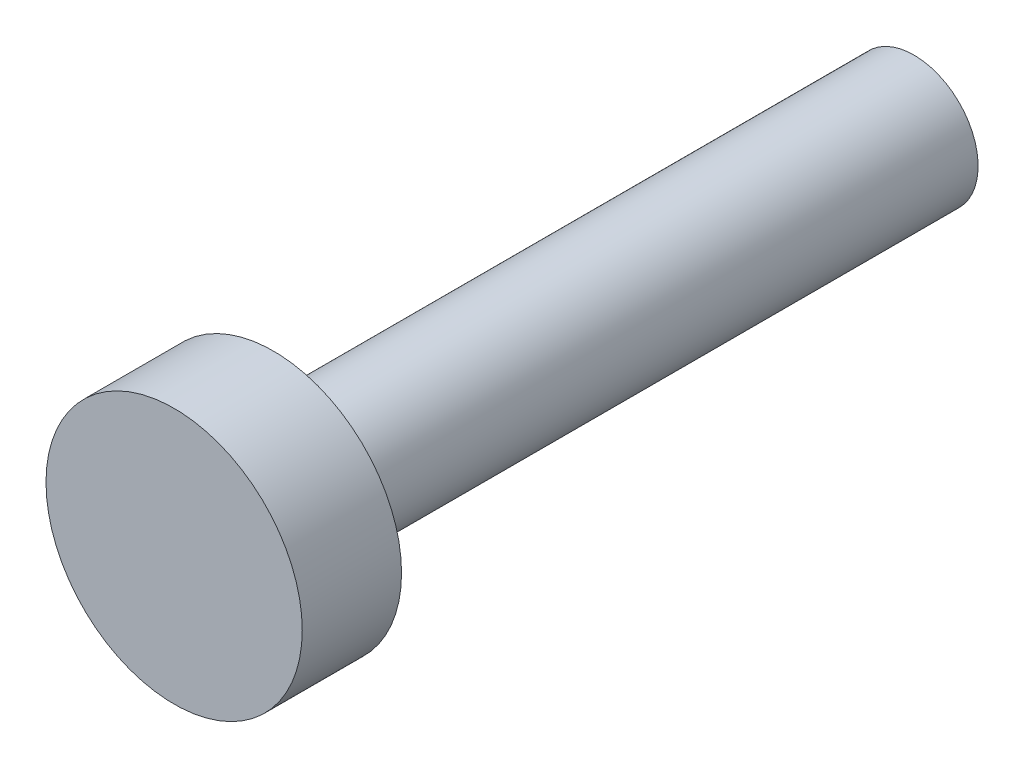
ISO-10303-21;
HEADER;
FILE_DESCRIPTION(('STEP AP214'),'2;1');
FILE_NAME('part.step','',(''),(''),'','','');
FILE_SCHEMA(('AUTOMOTIVE_DESIGN { 1 0 10303 214 1 1 1 1 }'));
ENDSEC;
DATA;
#1=APPLICATION_CONTEXT('core data for automotive mechanical design processes');
#2=APPLICATION_PROTOCOL_DEFINITION('international standard','automotive_design',2000,#1);
#3=PRODUCT_CONTEXT('',#1,'mechanical');
#4=PRODUCT('Part','Part','',(#3));
#5=PRODUCT_RELATED_PRODUCT_CATEGORY('part','',(#4));
#6=PRODUCT_DEFINITION_FORMATION('','',#4);
#7=PRODUCT_DEFINITION_CONTEXT('part definition',#1,'design');
#8=PRODUCT_DEFINITION('design','',#6,#7);
#9=PRODUCT_DEFINITION_SHAPE('','',#8);
#10=(LENGTH_UNIT() NAMED_UNIT(*) SI_UNIT(.MILLI.,.METRE.));
#11=(NAMED_UNIT(*) PLANE_ANGLE_UNIT() SI_UNIT($,.RADIAN.));
#12=(NAMED_UNIT(*) SI_UNIT($,.STERADIAN.) SOLID_ANGLE_UNIT());
#13=UNCERTAINTY_MEASURE_WITH_UNIT(LENGTH_MEASURE(1.E-05),#10,'distance_accuracy_value','');
#14=(GEOMETRIC_REPRESENTATION_CONTEXT(3) GLOBAL_UNCERTAINTY_ASSIGNED_CONTEXT((#13)) GLOBAL_UNIT_ASSIGNED_CONTEXT((#10,
#11,#12)) REPRESENTATION_CONTEXT('',''));
#15=CARTESIAN_POINT('',(0.,0.,0.));
#16=DIRECTION('',(0.,0.,1.));
#17=DIRECTION('',(1.,0.,0.));
#18=AXIS2_PLACEMENT_3D('',#15,#16,#17);
#19=CARTESIAN_POINT('',(0.,0.,3.1));
#20=DIRECTION('',(0.,0.,-1.));
#21=DIRECTION('',(-1.,0.,0.));
#22=AXIS2_PLACEMENT_3D('',#19,#20,#21);
#23=CYLINDRICAL_SURFACE('',#22,4.);
#24=CARTESIAN_POINT('',(0.,0.,3.1));
#25=DIRECTION('',(0.,0.,1.));
#26=DIRECTION('',(1.,0.,0.));
#27=AXIS2_PLACEMENT_3D('',#24,#25,#26);
#28=CIRCLE('',#27,4.);
#29=CARTESIAN_POINT('',(-4.,0.,3.1));
#30=VERTEX_POINT('',#29);
#31=EDGE_CURVE('E38',#30,#30,#28,.T.);
#32=CARTESIAN_POINT('',(0.,0.,0.));
#33=DIRECTION('',(0.,0.,1.));
#34=DIRECTION('',(1.,0.,0.));
#35=AXIS2_PLACEMENT_3D('',#32,#33,#34);
#36=CIRCLE('',#35,4.);
#37=CARTESIAN_POINT('',(-4.,0.,0.));
#38=VERTEX_POINT('',#37);
#39=EDGE_CURVE('E34',#38,#38,#36,.T.);
#40=CARTESIAN_POINT('',(-4.,0.,3.1));
#41=CARTESIAN_POINT('',(-4.,0.,3.06770833333333));
#42=CARTESIAN_POINT('',(-4.,0.,3.03541666666667));
#43=CARTESIAN_POINT('',(-4.,0.,2.97083333333333));
#44=CARTESIAN_POINT('',(-4.,0.,2.93854166666667));
#45=CARTESIAN_POINT('',(-4.,0.,2.87395833333333));
#46=CARTESIAN_POINT('',(-4.,0.,2.84166666666667));
#47=CARTESIAN_POINT('',(-4.,0.,2.77708333333333));
#48=CARTESIAN_POINT('',(-4.,0.,2.74479166666667));
#49=CARTESIAN_POINT('',(-4.,0.,2.68020833333333));
#50=CARTESIAN_POINT('',(-4.,0.,2.64791666666667));
#51=CARTESIAN_POINT('',(-4.,0.,2.58333333333333));
#52=CARTESIAN_POINT('',(-4.,0.,2.55104166666667));
#53=CARTESIAN_POINT('',(-4.,0.,2.48645833333333));
#54=CARTESIAN_POINT('',(-4.,0.,2.45416666666667));
#55=CARTESIAN_POINT('',(-4.,0.,2.38958333333333));
#56=CARTESIAN_POINT('',(-4.,0.,2.35729166666667));
#57=CARTESIAN_POINT('',(-4.,0.,2.29270833333333));
#58=CARTESIAN_POINT('',(-4.,0.,2.26041666666667));
#59=CARTESIAN_POINT('',(-4.,0.,2.19583333333333));
#60=CARTESIAN_POINT('',(-4.,0.,2.16354166666667));
#61=CARTESIAN_POINT('',(-4.,0.,2.09895833333333));
#62=CARTESIAN_POINT('',(-4.,0.,2.06666666666667));
#63=CARTESIAN_POINT('',(-4.,0.,2.00208333333333));
#64=CARTESIAN_POINT('',(-4.,0.,1.96979166666667));
#65=CARTESIAN_POINT('',(-4.,0.,1.90520833333333));
#66=CARTESIAN_POINT('',(-4.,0.,1.87291666666667));
#67=CARTESIAN_POINT('',(-4.,0.,1.80833333333333));
#68=CARTESIAN_POINT('',(-4.,0.,1.77604166666667));
#69=CARTESIAN_POINT('',(-4.,0.,1.71145833333333));
#70=CARTESIAN_POINT('',(-4.,0.,1.67916666666667));
#71=CARTESIAN_POINT('',(-4.,0.,1.61458333333333));
#72=CARTESIAN_POINT('',(-4.,0.,1.58229166666667));
#73=CARTESIAN_POINT('',(-4.,0.,1.51770833333333));
#74=CARTESIAN_POINT('',(-4.,0.,1.48541666666667));
#75=CARTESIAN_POINT('',(-4.,0.,1.42083333333333));
#76=CARTESIAN_POINT('',(-4.,0.,1.38854166666667));
#77=CARTESIAN_POINT('',(-4.,0.,1.32395833333333));
#78=CARTESIAN_POINT('',(-4.,0.,1.29166666666667));
#79=CARTESIAN_POINT('',(-4.,0.,1.22708333333333));
#80=CARTESIAN_POINT('',(-4.,0.,1.19479166666667));
#81=CARTESIAN_POINT('',(-4.,0.,1.13020833333333));
#82=CARTESIAN_POINT('',(-4.,0.,1.09791666666667));
#83=CARTESIAN_POINT('',(-4.,0.,1.03333333333333));
#84=CARTESIAN_POINT('',(-4.,0.,1.00104166666667));
#85=CARTESIAN_POINT('',(-4.,0.,0.936458333333333));
#86=CARTESIAN_POINT('',(-4.,0.,0.904166666666667));
#87=CARTESIAN_POINT('',(-4.,0.,0.839583333333333));
#88=CARTESIAN_POINT('',(-4.,0.,0.807291666666667));
#89=CARTESIAN_POINT('',(-4.,0.,0.742708333333333));
#90=CARTESIAN_POINT('',(-4.,0.,0.710416666666667));
#91=CARTESIAN_POINT('',(-4.,0.,0.645833333333333));
#92=CARTESIAN_POINT('',(-4.,0.,0.613541666666667));
#93=CARTESIAN_POINT('',(-4.,0.,0.548958333333333));
#94=CARTESIAN_POINT('',(-4.,0.,0.516666666666667));
#95=CARTESIAN_POINT('',(-4.,0.,0.452083333333333));
#96=CARTESIAN_POINT('',(-4.,0.,0.419791666666667));
#97=CARTESIAN_POINT('',(-4.,0.,0.355208333333333));
#98=CARTESIAN_POINT('',(-4.,0.,0.322916666666667));
#99=CARTESIAN_POINT('',(-4.,0.,0.258333333333333));
#100=CARTESIAN_POINT('',(-4.,0.,0.226041666666667));
#101=CARTESIAN_POINT('',(-4.,0.,0.161458333333333));
#102=CARTESIAN_POINT('',(-4.,0.,0.129166666666667));
#103=CARTESIAN_POINT('',(-4.,0.,0.0645833333333335));
#104=CARTESIAN_POINT('',(-4.,0.,0.0322916666666667));
#105=CARTESIAN_POINT('',(-4.,0.,0.));
#106=B_SPLINE_CURVE_WITH_KNOTS('',3,(#40,#41,#42,#43,#44,#45,#46,#47,#48,#49,#50,#51,#52,#53,
#54,#55,#56,#57,#58,#59,#60,#61,#62,#63,#64,#65,#66,#67,#68,#69,#70,#71,#72,#73,#74,#75,#76,#77,
#78,#79,#80,#81,#82,#83,#84,#85,#86,#87,#88,#89,#90,#91,#92,#93,#94,#95,#96,#97,#98,#99,#100,
#101,#102,#103,#104,#105),.UNSPECIFIED.,.F.,.F.,(4,2,2,2,2,2,2,2,2,2,2,2,2,2,2,2,2,2,2,2,2,2,2,
2,2,2,2,2,2,2,2,2,4),(0.,0.0968749999999997,0.19375,0.290625,0.3875,0.484375,0.58125,0.678125,
0.775,0.871874999999999,0.96875,1.065625,1.1625,1.259375,1.35625,1.453125,1.55,1.646875,1.74375,
1.840625,1.9375,2.034375,2.13125,2.228125,2.325,2.421875,2.51875,2.615625,2.7125,2.809375,
2.90625,3.003125,3.1),.UNSPECIFIED.);
#107=EDGE_CURVE('BSEAM31',#30,#38,#106,.T.);
#108=ORIENTED_EDGE('',*,*,#31,.F.);
#109=ORIENTED_EDGE('',*,*,#39,.T.);
#110=ORIENTED_EDGE('',*,*,#107,.T.);
#111=ORIENTED_EDGE('',*,*,#107,.F.);
#112=EDGE_LOOP('',(#108,#110,#109,#111));
#113=FACE_BOUND('',#112,.T.);
#114=ADVANCED_FACE('F31',(#113),#23,.T.);
#115=CARTESIAN_POINT('',(0.,0.,3.1));
#116=DIRECTION('',(0.,0.,1.));
#117=DIRECTION('',(1.,0.,0.));
#118=AXIS2_PLACEMENT_3D('',#115,#116,#117);
#119=PLANE('',#118);
#120=ORIENTED_EDGE('',*,*,#31,.T.);
#121=EDGE_LOOP('',(#120));
#122=FACE_BOUND('',#121,.T.);
#123=ADVANCED_FACE('F55',(#122),#119,.T.);
#124=CARTESIAN_POINT('',(0.,0.,0.));
#125=DIRECTION('',(0.,0.,1.));
#126=DIRECTION('',(1.,0.,0.));
#127=AXIS2_PLACEMENT_3D('',#124,#125,#126);
#128=PLANE('',#127);
#129=CARTESIAN_POINT('',(0.,0.,0.));
#130=DIRECTION('',(0.,0.,-1.));
#131=DIRECTION('',(-1.,0.,0.));
#132=AXIS2_PLACEMENT_3D('',#129,#130,#131);
#133=CIRCLE('',#132,2.);
#134=CARTESIAN_POINT('',(-2.,0.,0.));
#135=VERTEX_POINT('',#134);
#136=EDGE_CURVE('E10',#135,#135,#133,.T.);
#137=ORIENTED_EDGE('',*,*,#136,.F.);
#138=EDGE_LOOP('',(#137));
#139=FACE_BOUND('',#138,.T.);
#140=ORIENTED_EDGE('',*,*,#39,.F.);
#141=EDGE_LOOP('',(#140));
#142=FACE_BOUND('',#141,.T.);
#143=ADVANCED_FACE('F52',(#139,#142),#128,.F.);
#144=CARTESIAN_POINT('',(0.,0.,-20.));
#145=DIRECTION('',(0.,0.,1.));
#146=DIRECTION('',(1.,0.,0.));
#147=AXIS2_PLACEMENT_3D('',#144,#145,#146);
#148=CYLINDRICAL_SURFACE('',#147,2.);
#149=CARTESIAN_POINT('',(0.,0.,-20.));
#150=DIRECTION('',(0.,0.,-1.));
#151=DIRECTION('',(-1.,0.,0.));
#152=AXIS2_PLACEMENT_3D('',#149,#150,#151);
#153=CIRCLE('',#152,2.);
#154=CARTESIAN_POINT('',(-2.,0.,-20.));
#155=VERTEX_POINT('',#154);
#156=EDGE_CURVE('E44',#155,#155,#153,.T.);
#157=ORIENTED_EDGE('',*,*,#156,.F.);
#158=EDGE_LOOP('',(#157));
#159=FACE_BOUND('',#158,.T.);
#160=ORIENTED_EDGE('',*,*,#136,.T.);
#161=EDGE_LOOP('',(#160));
#162=FACE_BOUND('',#161,.T.);
#163=ADVANCED_FACE('F54',(#159,#162),#148,.T.);
#164=CARTESIAN_POINT('',(0.,0.,-20.));
#165=DIRECTION('',(0.,0.,-1.));
#166=DIRECTION('',(-1.,0.,0.));
#167=AXIS2_PLACEMENT_3D('',#164,#165,#166);
#168=PLANE('',#167);
#169=ORIENTED_EDGE('',*,*,#156,.T.);
#170=EDGE_LOOP('',(#169));
#171=FACE_BOUND('',#170,.T.);
#172=ADVANCED_FACE('F61',(#171),#168,.T.);
#173=CLOSED_SHELL('',(#114,#123,#143,#163,#172));
#174=MANIFOLD_SOLID_BREP('B2',#173);
#175=ADVANCED_BREP_SHAPE_REPRESENTATION('',(#18,#174),#14);
#176=SHAPE_DEFINITION_REPRESENTATION(#9,#175);
ENDSEC;
END-ISO-10303-21;
